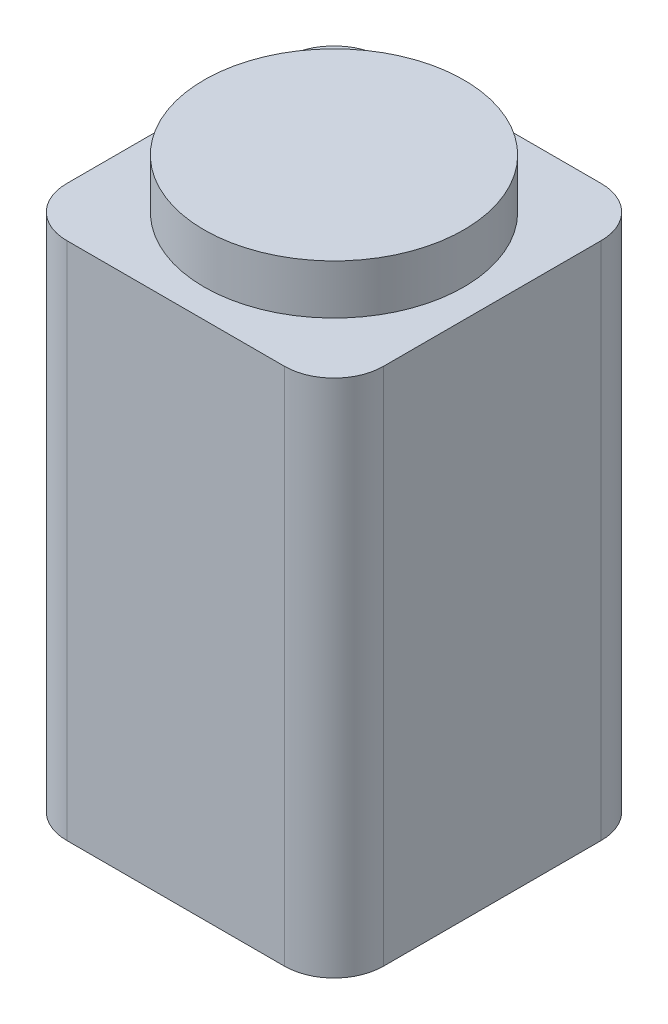
ISO-10303-21;
HEADER;
FILE_DESCRIPTION(('STEP AP214'),'2;1');
FILE_NAME('part.step','',(''),(''),'','','');
FILE_SCHEMA(('AUTOMOTIVE_DESIGN { 1 0 10303 214 1 1 1 1 }'));
ENDSEC;
DATA;
#1=APPLICATION_CONTEXT('core data for automotive mechanical design processes');
#2=APPLICATION_PROTOCOL_DEFINITION('international standard','automotive_design',2000,#1);
#3=PRODUCT_CONTEXT('',#1,'mechanical');
#4=PRODUCT('Part','Part','',(#3));
#5=PRODUCT_RELATED_PRODUCT_CATEGORY('part','',(#4));
#6=PRODUCT_DEFINITION_FORMATION('','',#4);
#7=PRODUCT_DEFINITION_CONTEXT('part definition',#1,'design');
#8=PRODUCT_DEFINITION('design','',#6,#7);
#9=PRODUCT_DEFINITION_SHAPE('','',#8);
#10=(LENGTH_UNIT() NAMED_UNIT(*) SI_UNIT(.MILLI.,.METRE.));
#11=(NAMED_UNIT(*) PLANE_ANGLE_UNIT() SI_UNIT($,.RADIAN.));
#12=(NAMED_UNIT(*) SI_UNIT($,.STERADIAN.) SOLID_ANGLE_UNIT());
#13=UNCERTAINTY_MEASURE_WITH_UNIT(LENGTH_MEASURE(1.E-05),#10,'distance_accuracy_value','');
#14=(GEOMETRIC_REPRESENTATION_CONTEXT(3) GLOBAL_UNCERTAINTY_ASSIGNED_CONTEXT((#13)) GLOBAL_UNIT_ASSIGNED_CONTEXT((#10,
#11,#12)) REPRESENTATION_CONTEXT('',''));
#15=CARTESIAN_POINT('',(0.,0.,0.));
#16=DIRECTION('',(0.,0.,1.));
#17=DIRECTION('',(1.,0.,0.));
#18=AXIS2_PLACEMENT_3D('',#15,#16,#17);
#19=CARTESIAN_POINT('',(-108.,210.,20.));
#20=DIRECTION('',(0.,-1.,0.));
#21=DIRECTION('',(0.,0.,-1.));
#22=AXIS2_PLACEMENT_3D('',#19,#20,#21);
#23=CYLINDRICAL_SURFACE('',#22,20.);
#24=CARTESIAN_POINT('',(-108.,0.,20.));
#25=DIRECTION('',(0.,1.,0.));
#26=DIRECTION('',(0.,0.,1.));
#27=AXIS2_PLACEMENT_3D('',#24,#25,#26);
#28=CIRCLE('',#27,20.);
#29=CARTESIAN_POINT('',(-108.,0.,0.));
#30=VERTEX_POINT('',#29);
#31=CARTESIAN_POINT('',(-128.,0.,20.0000000000001));
#32=VERTEX_POINT('',#31);
#33=EDGE_CURVE('E131',#30,#32,#28,.T.);
#34=ORIENTED_EDGE('',*,*,#33,.T.);
#35=DIRECTION('',(0.,-1.,0.));
#36=VECTOR('',#35,1.);
#37=CARTESIAN_POINT('',(-128.,210.,20.0000000000001));
#38=LINE('',#37,#36);
#39=CARTESIAN_POINT('',(-128.,210.,20.0000000000001));
#40=VERTEX_POINT('',#39);
#41=EDGE_CURVE('E36',#40,#32,#38,.T.);
#42=ORIENTED_EDGE('',*,*,#41,.F.);
#43=CARTESIAN_POINT('',(-108.,210.,20.));
#44=DIRECTION('',(0.,1.,0.));
#45=DIRECTION('',(0.,0.,1.));
#46=AXIS2_PLACEMENT_3D('',#43,#44,#45);
#47=CIRCLE('',#46,20.);
#48=CARTESIAN_POINT('',(-108.,210.,0.));
#49=VERTEX_POINT('',#48);
#50=EDGE_CURVE('E146',#49,#40,#47,.T.);
#51=ORIENTED_EDGE('',*,*,#50,.F.);
#52=DIRECTION('',(0.,-1.,0.));
#53=VECTOR('',#52,1.);
#54=CARTESIAN_POINT('',(-108.,210.,0.));
#55=LINE('',#54,#53);
#56=EDGE_CURVE('E127',#49,#30,#55,.T.);
#57=ORIENTED_EDGE('',*,*,#56,.T.);
#58=EDGE_LOOP('',(#34,#42,#51,#57));
#59=FACE_BOUND('',#58,.T.);
#60=ADVANCED_FACE('F33',(#59),#23,.T.);
#61=CARTESIAN_POINT('',(-128.,210.,20.0000000000001));
#62=DIRECTION('',(1.,0.,0.));
#63=DIRECTION('',(0.,0.,-1.));
#64=AXIS2_PLACEMENT_3D('',#61,#62,#63);
#65=PLANE('',#64);
#66=DIRECTION('',(0.,0.,1.));
#67=VECTOR('',#66,1.);
#68=CARTESIAN_POINT('',(-128.,0.,20.0000000000001));
#69=LINE('',#68,#67);
#70=CARTESIAN_POINT('',(-128.,0.,108.));
#71=VERTEX_POINT('',#70);
#72=EDGE_CURVE('E134',#32,#71,#69,.T.);
#73=ORIENTED_EDGE('',*,*,#72,.T.);
#74=DIRECTION('',(0.,-1.,0.));
#75=VECTOR('',#74,1.);
#76=CARTESIAN_POINT('',(-128.,210.,108.));
#77=LINE('',#76,#75);
#78=CARTESIAN_POINT('',(-128.,210.,108.));
#79=VERTEX_POINT('',#78);
#80=EDGE_CURVE('E155',#79,#71,#77,.T.);
#81=ORIENTED_EDGE('',*,*,#80,.F.);
#82=DIRECTION('',(0.,0.,1.));
#83=VECTOR('',#82,1.);
#84=CARTESIAN_POINT('',(-128.,210.,20.0000000000001));
#85=LINE('',#84,#83);
#86=EDGE_CURVE('E94',#40,#79,#85,.T.);
#87=ORIENTED_EDGE('',*,*,#86,.F.);
#88=ORIENTED_EDGE('',*,*,#41,.T.);
#89=EDGE_LOOP('',(#73,#81,#87,#88));
#90=FACE_BOUND('',#89,.T.);
#91=ADVANCED_FACE('F161',(#90),#65,.F.);
#92=CARTESIAN_POINT('',(-108.,210.,108.));
#93=DIRECTION('',(0.,-1.,0.));
#94=DIRECTION('',(0.,0.,-1.));
#95=AXIS2_PLACEMENT_3D('',#92,#93,#94);
#96=CYLINDRICAL_SURFACE('',#95,20.);
#97=CARTESIAN_POINT('',(-108.,0.,108.));
#98=DIRECTION('',(0.,1.,0.));
#99=DIRECTION('',(0.,0.,1.));
#100=AXIS2_PLACEMENT_3D('',#97,#98,#99);
#101=CIRCLE('',#100,20.);
#102=CARTESIAN_POINT('',(-108.,0.,128.));
#103=VERTEX_POINT('',#102);
#104=EDGE_CURVE('E137',#71,#103,#101,.T.);
#105=ORIENTED_EDGE('',*,*,#104,.T.);
#106=DIRECTION('',(0.,-1.,0.));
#107=VECTOR('',#106,1.);
#108=CARTESIAN_POINT('',(-108.,210.,128.));
#109=LINE('',#108,#107);
#110=CARTESIAN_POINT('',(-108.,210.,128.));
#111=VERTEX_POINT('',#110);
#112=EDGE_CURVE('E153',#111,#103,#109,.T.);
#113=ORIENTED_EDGE('',*,*,#112,.F.);
#114=CARTESIAN_POINT('',(-108.,210.,108.));
#115=DIRECTION('',(0.,1.,0.));
#116=DIRECTION('',(0.,0.,1.));
#117=AXIS2_PLACEMENT_3D('',#114,#115,#116);
#118=CIRCLE('',#117,20.);
#119=EDGE_CURVE('E176',#79,#111,#118,.T.);
#120=ORIENTED_EDGE('',*,*,#119,.F.);
#121=ORIENTED_EDGE('',*,*,#80,.T.);
#122=EDGE_LOOP('',(#105,#113,#120,#121));
#123=FACE_BOUND('',#122,.T.);
#124=ADVANCED_FACE('F170',(#123),#96,.T.);
#125=CARTESIAN_POINT('',(-20.0000000000001,210.,128.));
#126=DIRECTION('',(0.,0.,-1.));
#127=DIRECTION('',(-1.,0.,0.));
#128=AXIS2_PLACEMENT_3D('',#125,#126,#127);
#129=PLANE('',#128);
#130=DIRECTION('',(1.,0.,0.));
#131=VECTOR('',#130,1.);
#132=CARTESIAN_POINT('',(-20.0000000000001,0.,128.));
#133=LINE('',#132,#131);
#134=CARTESIAN_POINT('',(-20.0000000000001,0.,128.));
#135=VERTEX_POINT('',#134);
#136=EDGE_CURVE('E139',#103,#135,#133,.T.);
#137=ORIENTED_EDGE('',*,*,#136,.T.);
#138=DIRECTION('',(0.,-1.,0.));
#139=VECTOR('',#138,1.);
#140=CARTESIAN_POINT('',(-20.0000000000001,210.,128.));
#141=LINE('',#140,#139);
#142=CARTESIAN_POINT('',(-20.0000000000001,210.,128.));
#143=VERTEX_POINT('',#142);
#144=EDGE_CURVE('E150',#143,#135,#141,.T.);
#145=ORIENTED_EDGE('',*,*,#144,.F.);
#146=DIRECTION('',(1.,0.,0.));
#147=VECTOR('',#146,1.);
#148=CARTESIAN_POINT('',(-20.0000000000001,210.,128.));
#149=LINE('',#148,#147);
#150=EDGE_CURVE('E175',#111,#143,#149,.T.);
#151=ORIENTED_EDGE('',*,*,#150,.F.);
#152=ORIENTED_EDGE('',*,*,#112,.T.);
#153=EDGE_LOOP('',(#137,#145,#151,#152));
#154=FACE_BOUND('',#153,.T.);
#155=ADVANCED_FACE('F173',(#154),#129,.F.);
#156=CARTESIAN_POINT('',(-20.,210.,108.));
#157=DIRECTION('',(0.,-1.,0.));
#158=DIRECTION('',(0.,0.,-1.));
#159=AXIS2_PLACEMENT_3D('',#156,#157,#158);
#160=CYLINDRICAL_SURFACE('',#159,20.);
#161=CARTESIAN_POINT('',(-20.,0.,108.));
#162=DIRECTION('',(0.,1.,0.));
#163=DIRECTION('',(0.,0.,1.));
#164=AXIS2_PLACEMENT_3D('',#161,#162,#163);
#165=CIRCLE('',#164,20.);
#166=CARTESIAN_POINT('',(0.,0.,108.));
#167=VERTEX_POINT('',#166);
#168=EDGE_CURVE('E141',#135,#167,#165,.T.);
#169=ORIENTED_EDGE('',*,*,#168,.T.);
#170=DIRECTION('',(0.,-1.,0.));
#171=VECTOR('',#170,1.);
#172=CARTESIAN_POINT('',(0.,210.,108.));
#173=LINE('',#172,#171);
#174=CARTESIAN_POINT('',(0.,210.,108.));
#175=VERTEX_POINT('',#174);
#176=EDGE_CURVE('E122',#175,#167,#173,.T.);
#177=ORIENTED_EDGE('',*,*,#176,.F.);
#178=CARTESIAN_POINT('',(-20.,210.,108.));
#179=DIRECTION('',(0.,1.,0.));
#180=DIRECTION('',(0.,0.,1.));
#181=AXIS2_PLACEMENT_3D('',#178,#179,#180);
#182=CIRCLE('',#181,20.);
#183=EDGE_CURVE('E113',#143,#175,#182,.T.);
#184=ORIENTED_EDGE('',*,*,#183,.F.);
#185=ORIENTED_EDGE('',*,*,#144,.T.);
#186=EDGE_LOOP('',(#169,#177,#184,#185));
#187=FACE_BOUND('',#186,.T.);
#188=ADVANCED_FACE('F213',(#187),#160,.T.);
#189=CARTESIAN_POINT('',(0.,210.,20.0000000000001));
#190=DIRECTION('',(-1.,0.,0.));
#191=DIRECTION('',(0.,0.,1.));
#192=AXIS2_PLACEMENT_3D('',#189,#190,#191);
#193=PLANE('',#192);
#194=DIRECTION('',(0.,0.,-1.));
#195=VECTOR('',#194,1.);
#196=CARTESIAN_POINT('',(0.,0.,20.0000000000001));
#197=LINE('',#196,#195);
#198=CARTESIAN_POINT('',(0.,0.,20.0000000000001));
#199=VERTEX_POINT('',#198);
#200=EDGE_CURVE('E121',#167,#199,#197,.T.);
#201=ORIENTED_EDGE('',*,*,#200,.T.);
#202=DIRECTION('',(0.,-1.,0.));
#203=VECTOR('',#202,1.);
#204=CARTESIAN_POINT('',(0.,210.,20.0000000000001));
#205=LINE('',#204,#203);
#206=CARTESIAN_POINT('',(0.,210.,20.0000000000001));
#207=VERTEX_POINT('',#206);
#208=EDGE_CURVE('E118',#207,#199,#205,.T.);
#209=ORIENTED_EDGE('',*,*,#208,.F.);
#210=DIRECTION('',(0.,0.,-1.));
#211=VECTOR('',#210,1.);
#212=CARTESIAN_POINT('',(0.,210.,20.0000000000001));
#213=LINE('',#212,#211);
#214=EDGE_CURVE('E107',#175,#207,#213,.T.);
#215=ORIENTED_EDGE('',*,*,#214,.F.);
#216=ORIENTED_EDGE('',*,*,#176,.T.);
#217=EDGE_LOOP('',(#201,#209,#215,#216));
#218=FACE_BOUND('',#217,.T.);
#219=ADVANCED_FACE('F119',(#218),#193,.F.);
#220=CARTESIAN_POINT('',(-20.,210.,20.));
#221=DIRECTION('',(0.,-1.,0.));
#222=DIRECTION('',(0.,0.,-1.));
#223=AXIS2_PLACEMENT_3D('',#220,#221,#222);
#224=CYLINDRICAL_SURFACE('',#223,20.);
#225=CARTESIAN_POINT('',(-20.,0.,20.));
#226=DIRECTION('',(0.,1.,0.));
#227=DIRECTION('',(0.,0.,1.));
#228=AXIS2_PLACEMENT_3D('',#225,#226,#227);
#229=CIRCLE('',#228,20.);
#230=CARTESIAN_POINT('',(-20.0000000000001,0.,0.));
#231=VERTEX_POINT('',#230);
#232=EDGE_CURVE('E79',#199,#231,#229,.T.);
#233=ORIENTED_EDGE('',*,*,#232,.T.);
#234=DIRECTION('',(0.,-1.,0.));
#235=VECTOR('',#234,1.);
#236=CARTESIAN_POINT('',(-20.0000000000001,210.,0.));
#237=LINE('',#236,#235);
#238=CARTESIAN_POINT('',(-20.0000000000001,210.,0.));
#239=VERTEX_POINT('',#238);
#240=EDGE_CURVE('E123',#239,#231,#237,.T.);
#241=ORIENTED_EDGE('',*,*,#240,.F.);
#242=CARTESIAN_POINT('',(-20.,210.,20.));
#243=DIRECTION('',(0.,1.,0.));
#244=DIRECTION('',(0.,0.,1.));
#245=AXIS2_PLACEMENT_3D('',#242,#243,#244);
#246=CIRCLE('',#245,20.);
#247=EDGE_CURVE('E111',#207,#239,#246,.T.);
#248=ORIENTED_EDGE('',*,*,#247,.F.);
#249=ORIENTED_EDGE('',*,*,#208,.T.);
#250=EDGE_LOOP('',(#233,#241,#248,#249));
#251=FACE_BOUND('',#250,.T.);
#252=ADVANCED_FACE('F125',(#251),#224,.T.);
#253=CARTESIAN_POINT('',(-20.0000000000001,210.,0.));
#254=DIRECTION('',(0.,0.,1.));
#255=DIRECTION('',(1.,0.,0.));
#256=AXIS2_PLACEMENT_3D('',#253,#254,#255);
#257=PLANE('',#256);
#258=DIRECTION('',(-1.,0.,0.));
#259=VECTOR('',#258,1.);
#260=CARTESIAN_POINT('',(-20.0000000000001,0.,0.));
#261=LINE('',#260,#259);
#262=EDGE_CURVE('E85',#231,#30,#261,.T.);
#263=ORIENTED_EDGE('',*,*,#262,.T.);
#264=ORIENTED_EDGE('',*,*,#56,.F.);
#265=DIRECTION('',(-1.,0.,0.));
#266=VECTOR('',#265,1.);
#267=CARTESIAN_POINT('',(-20.0000000000001,210.,0.));
#268=LINE('',#267,#266);
#269=EDGE_CURVE('E50',#239,#49,#268,.T.);
#270=ORIENTED_EDGE('',*,*,#269,.F.);
#271=ORIENTED_EDGE('',*,*,#240,.T.);
#272=EDGE_LOOP('',(#263,#264,#270,#271));
#273=FACE_BOUND('',#272,.T.);
#274=ADVANCED_FACE('F194',(#273),#257,.F.);
#275=CARTESIAN_POINT('',(-108.,210.,20.));
#276=DIRECTION('',(0.,1.,0.));
#277=DIRECTION('',(0.,0.,1.));
#278=AXIS2_PLACEMENT_3D('',#275,#276,#277);
#279=PLANE('',#278);
#280=CARTESIAN_POINT('',(-64.,210.,64.));
#281=DIRECTION('',(0.,1.,0.));
#282=DIRECTION('',(0.,0.,1.));
#283=AXIS2_PLACEMENT_3D('',#280,#281,#282);
#284=CIRCLE('',#283,52.5);
#285=CARTESIAN_POINT('',(-64.,210.,116.5));
#286=VERTEX_POINT('',#285);
#287=EDGE_CURVE('E11',#286,#286,#284,.T.);
#288=ORIENTED_EDGE('',*,*,#287,.F.);
#289=EDGE_LOOP('',(#288));
#290=FACE_BOUND('',#289,.T.);
#291=ORIENTED_EDGE('',*,*,#50,.T.);
#292=ORIENTED_EDGE('',*,*,#86,.T.);
#293=ORIENTED_EDGE('',*,*,#119,.T.);
#294=ORIENTED_EDGE('',*,*,#150,.T.);
#295=ORIENTED_EDGE('',*,*,#183,.T.);
#296=ORIENTED_EDGE('',*,*,#214,.T.);
#297=ORIENTED_EDGE('',*,*,#247,.T.);
#298=ORIENTED_EDGE('',*,*,#269,.T.);
#299=EDGE_LOOP('',(#291,#292,#293,#294,#295,#296,#297,#298));
#300=FACE_BOUND('',#299,.T.);
#301=ADVANCED_FACE('F109',(#290,#300),#279,.T.);
#302=CARTESIAN_POINT('',(-108.,0.,20.));
#303=DIRECTION('',(0.,1.,0.));
#304=DIRECTION('',(0.,0.,1.));
#305=AXIS2_PLACEMENT_3D('',#302,#303,#304);
#306=PLANE('',#305);
#307=ORIENTED_EDGE('',*,*,#33,.F.);
#308=ORIENTED_EDGE('',*,*,#262,.F.);
#309=ORIENTED_EDGE('',*,*,#232,.F.);
#310=ORIENTED_EDGE('',*,*,#200,.F.);
#311=ORIENTED_EDGE('',*,*,#168,.F.);
#312=ORIENTED_EDGE('',*,*,#136,.F.);
#313=ORIENTED_EDGE('',*,*,#104,.F.);
#314=ORIENTED_EDGE('',*,*,#72,.F.);
#315=EDGE_LOOP('',(#307,#308,#309,#310,#311,#312,#313,#314));
#316=FACE_BOUND('',#315,.T.);
#317=ADVANCED_FACE('F166',(#316),#306,.F.);
#318=CARTESIAN_POINT('',(-64.,230.,64.));
#319=DIRECTION('',(0.,-1.,0.));
#320=DIRECTION('',(0.,0.,-1.));
#321=AXIS2_PLACEMENT_3D('',#318,#319,#320);
#322=CYLINDRICAL_SURFACE('',#321,52.5);
#323=CARTESIAN_POINT('',(-64.,230.,64.));
#324=DIRECTION('',(0.,1.,0.));
#325=DIRECTION('',(0.,0.,1.));
#326=AXIS2_PLACEMENT_3D('',#323,#324,#325);
#327=CIRCLE('',#326,52.5);
#328=CARTESIAN_POINT('',(-64.,230.,116.5));
#329=VERTEX_POINT('',#328);
#330=EDGE_CURVE('E135',#329,#329,#327,.T.);
#331=ORIENTED_EDGE('',*,*,#330,.F.);
#332=EDGE_LOOP('',(#331));
#333=FACE_BOUND('',#332,.T.);
#334=ORIENTED_EDGE('',*,*,#287,.T.);
#335=EDGE_LOOP('',(#334));
#336=FACE_BOUND('',#335,.T.);
#337=ADVANCED_FACE('F187',(#333,#336),#322,.T.);
#338=CARTESIAN_POINT('',(-64.,230.,64.));
#339=DIRECTION('',(0.,1.,0.));
#340=DIRECTION('',(0.,0.,1.));
#341=AXIS2_PLACEMENT_3D('',#338,#339,#340);
#342=PLANE('',#341);
#343=ORIENTED_EDGE('',*,*,#330,.T.);
#344=EDGE_LOOP('',(#343));
#345=FACE_BOUND('',#344,.T.);
#346=ADVANCED_FACE('F185',(#345),#342,.T.);
#347=CLOSED_SHELL('',(#60,#91,#124,#155,#188,#219,#252,#274,#301,#317,#337,#346));
#348=MANIFOLD_SOLID_BREP('B2',#347);
#349=ADVANCED_BREP_SHAPE_REPRESENTATION('',(#18,#348),#14);
#350=SHAPE_DEFINITION_REPRESENTATION(#9,#349);
ENDSEC;
END-ISO-10303-21;
